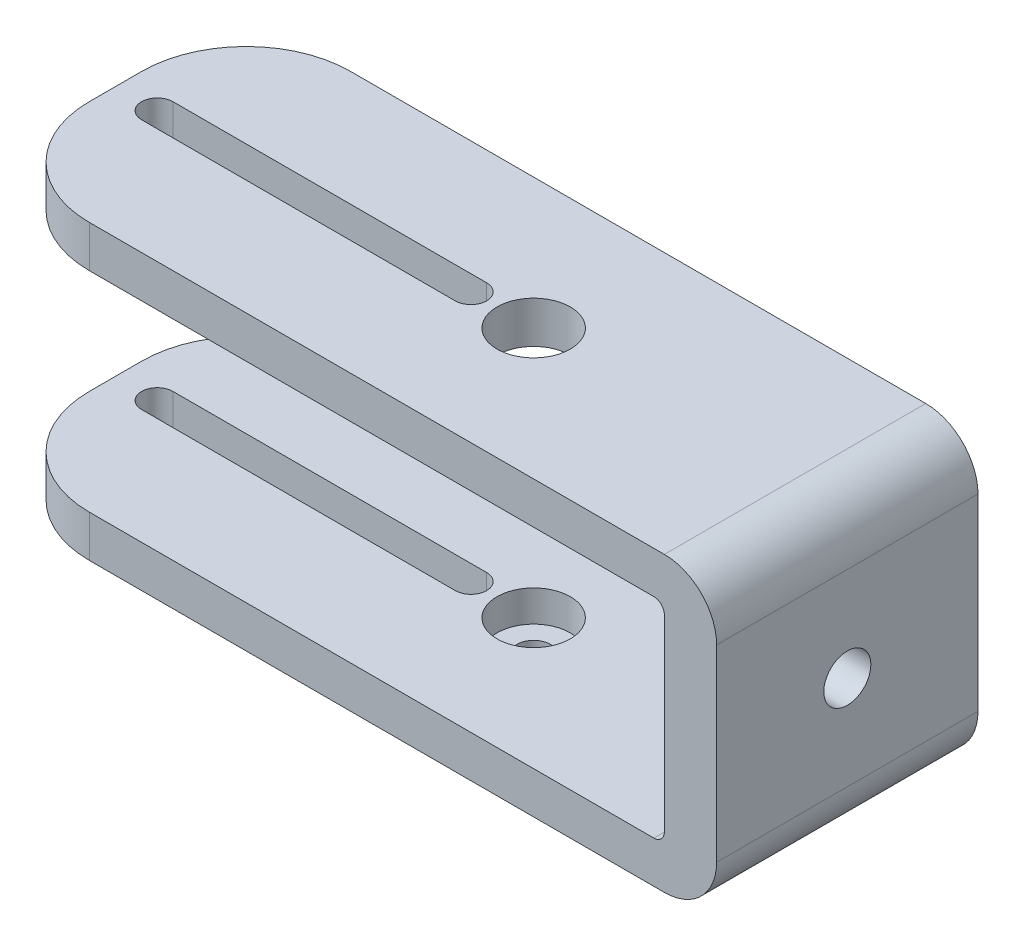
ISO-10303-21;
HEADER;
FILE_DESCRIPTION(('STEP AP214'),'2;1');
FILE_NAME('part.step','',(''),(''),'','','');
FILE_SCHEMA(('AUTOMOTIVE_DESIGN { 1 0 10303 214 1 1 1 1 }'));
ENDSEC;
DATA;
#1=APPLICATION_CONTEXT('core data for automotive mechanical design processes');
#2=APPLICATION_PROTOCOL_DEFINITION('international standard','automotive_design',2000,#1);
#3=PRODUCT_CONTEXT('',#1,'mechanical');
#4=PRODUCT('Part','Part','',(#3));
#5=PRODUCT_RELATED_PRODUCT_CATEGORY('part','',(#4));
#6=PRODUCT_DEFINITION_FORMATION('','',#4);
#7=PRODUCT_DEFINITION_CONTEXT('part definition',#1,'design');
#8=PRODUCT_DEFINITION('design','',#6,#7);
#9=PRODUCT_DEFINITION_SHAPE('','',#8);
#10=(LENGTH_UNIT() NAMED_UNIT(*) SI_UNIT(.MILLI.,.METRE.));
#11=(NAMED_UNIT(*) PLANE_ANGLE_UNIT() SI_UNIT($,.RADIAN.));
#12=(NAMED_UNIT(*) SI_UNIT($,.STERADIAN.) SOLID_ANGLE_UNIT());
#13=UNCERTAINTY_MEASURE_WITH_UNIT(LENGTH_MEASURE(1.E-05),#10,'distance_accuracy_value','');
#14=(GEOMETRIC_REPRESENTATION_CONTEXT(3) GLOBAL_UNCERTAINTY_ASSIGNED_CONTEXT((#13)) GLOBAL_UNIT_ASSIGNED_CONTEXT((#10,
#11,#12)) REPRESENTATION_CONTEXT('',''));
#15=CARTESIAN_POINT('',(0.,0.,0.));
#16=DIRECTION('',(0.,0.,1.));
#17=DIRECTION('',(1.,0.,0.));
#18=AXIS2_PLACEMENT_3D('',#15,#16,#17);
#19=CARTESIAN_POINT('',(5.,4.,0.));
#20=DIRECTION('',(0.,-1.,0.));
#21=DIRECTION('',(0.,0.,-1.));
#22=AXIS2_PLACEMENT_3D('',#19,#20,#21);
#23=CYLINDRICAL_SURFACE('',#22,1.6);
#24=CARTESIAN_POINT('',(5.,0.,0.));
#25=DIRECTION('',(0.,-1.,0.));
#26=DIRECTION('',(0.,0.,-1.));
#27=AXIS2_PLACEMENT_3D('',#24,#25,#26);
#28=CIRCLE('',#27,1.6);
#29=CARTESIAN_POINT('',(5.,0.,-1.6));
#30=VERTEX_POINT('',#29);
#31=EDGE_CURVE('E299',#30,#30,#28,.T.);
#32=ORIENTED_EDGE('',*,*,#31,.T.);
#33=EDGE_LOOP('',(#32));
#34=FACE_BOUND('',#33,.T.);
#35=CARTESIAN_POINT('',(5.,1.,0.));
#36=DIRECTION('',(0.,1.,0.));
#37=DIRECTION('',(0.,0.,1.));
#38=AXIS2_PLACEMENT_3D('',#35,#36,#37);
#39=CIRCLE('',#38,1.6);
#40=CARTESIAN_POINT('',(5.,1.,1.6));
#41=VERTEX_POINT('',#40);
#42=EDGE_CURVE('E295',#41,#41,#39,.F.);
#43=ORIENTED_EDGE('',*,*,#42,.F.);
#44=EDGE_LOOP('',(#43));
#45=FACE_BOUND('',#44,.T.);
#46=ADVANCED_FACE('F39',(#34,#45),#23,.F.);
#47=CARTESIAN_POINT('',(35.,4.,-12.5));
#48=DIRECTION('',(-1.,0.,0.));
#49=DIRECTION('',(0.,0.,1.));
#50=AXIS2_PLACEMENT_3D('',#47,#48,#49);
#51=PLANE('',#50);
#52=CARTESIAN_POINT('',(35.,14.,0.));
#53=DIRECTION('',(1.,0.,0.));
#54=DIRECTION('',(0.,0.,-1.));
#55=AXIS2_PLACEMENT_3D('',#52,#53,#54);
#56=CIRCLE('',#55,2.25);
#57=CARTESIAN_POINT('',(35.,14.,-2.25));
#58=VERTEX_POINT('',#57);
#59=EDGE_CURVE('E243',#58,#58,#56,.T.);
#60=ORIENTED_EDGE('',*,*,#59,.F.);
#61=EDGE_LOOP('',(#60));
#62=FACE_BOUND('',#61,.T.);
#63=DIRECTION('',(0.,-1.,0.));
#64=VECTOR('',#63,1.);
#65=CARTESIAN_POINT('',(35.,4.,12.5));
#66=LINE('',#65,#64);
#67=CARTESIAN_POINT('',(35.,23.,12.5));
#68=VERTEX_POINT('',#67);
#69=CARTESIAN_POINT('',(35.,5.,12.5));
#70=VERTEX_POINT('',#69);
#71=EDGE_CURVE('E345',#68,#70,#66,.T.);
#72=ORIENTED_EDGE('',*,*,#71,.T.);
#73=DIRECTION('',(0.,0.,-1.));
#74=VECTOR('',#73,1.);
#75=CARTESIAN_POINT('',(35.,5.,-12.5));
#76=LINE('',#75,#74);
#77=CARTESIAN_POINT('',(35.,5.,-12.5));
#78=VERTEX_POINT('',#77);
#79=EDGE_CURVE('E465',#70,#78,#76,.T.);
#80=ORIENTED_EDGE('',*,*,#79,.T.);
#81=DIRECTION('',(0.,-1.,0.));
#82=VECTOR('',#81,1.);
#83=CARTESIAN_POINT('',(35.,4.,-12.5));
#84=LINE('',#83,#82);
#85=CARTESIAN_POINT('',(35.,23.,-12.5));
#86=VERTEX_POINT('',#85);
#87=EDGE_CURVE('E357',#86,#78,#84,.T.);
#88=ORIENTED_EDGE('',*,*,#87,.F.);
#89=DIRECTION('',(0.,0.,-1.));
#90=VECTOR('',#89,1.);
#91=CARTESIAN_POINT('',(35.,23.,-12.5));
#92=LINE('',#91,#90);
#93=EDGE_CURVE('E462',#86,#68,#92,.F.);
#94=ORIENTED_EDGE('',*,*,#93,.T.);
#95=EDGE_LOOP('',(#72,#80,#88,#94));
#96=FACE_BOUND('',#95,.T.);
#97=ADVANCED_FACE('F484',(#62,#96),#51,.F.);
#98=CARTESIAN_POINT('',(-35.,4.,-12.5));
#99=DIRECTION('',(0.,0.,1.));
#100=DIRECTION('',(1.,0.,0.));
#101=AXIS2_PLACEMENT_3D('',#98,#99,#100);
#102=PLANE('',#101);
#103=ORIENTED_EDGE('',*,*,#87,.T.);
#104=CARTESIAN_POINT('',(30.,5.,-12.5));
#105=DIRECTION('',(0.,0.,1.));
#106=DIRECTION('',(1.,0.,0.));
#107=AXIS2_PLACEMENT_3D('',#104,#105,#106);
#108=CIRCLE('',#107,5.);
#109=CARTESIAN_POINT('',(30.,0.,-12.5));
#110=VERTEX_POINT('',#109);
#111=EDGE_CURVE('E472',#78,#110,#108,.F.);
#112=ORIENTED_EDGE('',*,*,#111,.T.);
#113=DIRECTION('',(-1.,0.,0.));
#114=VECTOR('',#113,1.);
#115=CARTESIAN_POINT('',(-35.,0.,-12.5));
#116=LINE('',#115,#114);
#117=CARTESIAN_POINT('',(-25.,0.,-12.5));
#118=VERTEX_POINT('',#117);
#119=EDGE_CURVE('E332',#110,#118,#116,.T.);
#120=ORIENTED_EDGE('',*,*,#119,.T.);
#121=DIRECTION('',(0.,-1.,0.));
#122=VECTOR('',#121,1.);
#123=CARTESIAN_POINT('',(-25.,4.,-12.5));
#124=LINE('',#123,#122);
#125=CARTESIAN_POINT('',(-25.,4.,-12.5));
#126=VERTEX_POINT('',#125);
#127=EDGE_CURVE('E429',#118,#126,#124,.F.);
#128=ORIENTED_EDGE('',*,*,#127,.T.);
#129=DIRECTION('',(-1.,0.,0.));
#130=VECTOR('',#129,1.);
#131=CARTESIAN_POINT('',(-35.,4.,-12.5));
#132=LINE('',#131,#130);
#133=CARTESIAN_POINT('',(29.,4.,-12.5));
#134=VERTEX_POINT('',#133);
#135=EDGE_CURVE('E333',#134,#126,#132,.T.);
#136=ORIENTED_EDGE('',*,*,#135,.F.);
#137=CARTESIAN_POINT('',(29.,5.,-12.5));
#138=DIRECTION('',(0.,0.,1.));
#139=DIRECTION('',(1.,0.,0.));
#140=AXIS2_PLACEMENT_3D('',#137,#138,#139);
#141=CIRCLE('',#140,1.);
#142=CARTESIAN_POINT('',(30.,5.,-12.5));
#143=VERTEX_POINT('',#142);
#144=EDGE_CURVE('E459',#134,#143,#141,.T.);
#145=ORIENTED_EDGE('',*,*,#144,.T.);
#146=DIRECTION('',(0.,-1.,0.));
#147=VECTOR('',#146,1.);
#148=CARTESIAN_POINT('',(30.,24.,-12.5));
#149=LINE('',#148,#147);
#150=CARTESIAN_POINT('',(30.,23.,-12.5));
#151=VERTEX_POINT('',#150);
#152=EDGE_CURVE('E328',#151,#143,#149,.T.);
#153=ORIENTED_EDGE('',*,*,#152,.F.);
#154=CARTESIAN_POINT('',(29.,23.,-12.5));
#155=DIRECTION('',(0.,0.,1.));
#156=DIRECTION('',(1.,0.,0.));
#157=AXIS2_PLACEMENT_3D('',#154,#155,#156);
#158=CIRCLE('',#157,1.);
#159=CARTESIAN_POINT('',(29.,24.,-12.5));
#160=VERTEX_POINT('',#159);
#161=EDGE_CURVE('E453',#151,#160,#158,.T.);
#162=ORIENTED_EDGE('',*,*,#161,.T.);
#163=DIRECTION('',(-1.,0.,0.));
#164=VECTOR('',#163,1.);
#165=CARTESIAN_POINT('',(35.,24.,-12.5));
#166=LINE('',#165,#164);
#167=CARTESIAN_POINT('',(-25.,24.,-12.5));
#168=VERTEX_POINT('',#167);
#169=EDGE_CURVE('E303',#160,#168,#166,.T.);
#170=ORIENTED_EDGE('',*,*,#169,.T.);
#171=DIRECTION('',(0.,-1.,0.));
#172=VECTOR('',#171,1.);
#173=CARTESIAN_POINT('',(-25.,4.,-12.5));
#174=LINE('',#173,#172);
#175=CARTESIAN_POINT('',(-25.,28.,-12.5));
#176=VERTEX_POINT('',#175);
#177=EDGE_CURVE('E425',#168,#176,#174,.F.);
#178=ORIENTED_EDGE('',*,*,#177,.T.);
#179=DIRECTION('',(-1.,0.,0.));
#180=VECTOR('',#179,1.);
#181=CARTESIAN_POINT('',(35.,28.,-12.5));
#182=LINE('',#181,#180);
#183=CARTESIAN_POINT('',(30.,28.,-12.5));
#184=VERTEX_POINT('',#183);
#185=EDGE_CURVE('E304',#184,#176,#182,.T.);
#186=ORIENTED_EDGE('',*,*,#185,.F.);
#187=CARTESIAN_POINT('',(30.,23.,-12.5));
#188=DIRECTION('',(0.,0.,1.));
#189=DIRECTION('',(1.,0.,0.));
#190=AXIS2_PLACEMENT_3D('',#187,#188,#189);
#191=CIRCLE('',#190,5.);
#192=EDGE_CURVE('E469',#184,#86,#191,.F.);
#193=ORIENTED_EDGE('',*,*,#192,.T.);
#194=EDGE_LOOP('',(#103,#112,#120,#128,#136,#145,#153,#162,#170,#178,#186,#193));
#195=FACE_BOUND('',#194,.T.);
#196=ADVANCED_FACE('F489',(#195),#102,.F.);
#197=CARTESIAN_POINT('',(-35.,4.,-12.5));
#198=DIRECTION('',(1.,0.,0.));
#199=DIRECTION('',(0.,0.,-1.));
#200=AXIS2_PLACEMENT_3D('',#197,#198,#199);
#201=PLANE('',#200);
#202=DIRECTION('',(0.,0.,1.));
#203=VECTOR('',#202,1.);
#204=CARTESIAN_POINT('',(-35.,0.,-12.5));
#205=LINE('',#204,#203);
#206=CARTESIAN_POINT('',(-35.,0.,-2.5));
#207=VERTEX_POINT('',#206);
#208=CARTESIAN_POINT('',(-35.,0.,2.5));
#209=VERTEX_POINT('',#208);
#210=EDGE_CURVE('E348',#207,#209,#205,.T.);
#211=ORIENTED_EDGE('',*,*,#210,.T.);
#212=DIRECTION('',(0.,-1.,0.));
#213=VECTOR('',#212,1.);
#214=CARTESIAN_POINT('',(-35.,4.,2.5));
#215=LINE('',#214,#213);
#216=CARTESIAN_POINT('',(-35.,4.,2.5));
#217=VERTEX_POINT('',#216);
#218=EDGE_CURVE('E416',#209,#217,#215,.F.);
#219=ORIENTED_EDGE('',*,*,#218,.T.);
#220=DIRECTION('',(0.,0.,1.));
#221=VECTOR('',#220,1.);
#222=CARTESIAN_POINT('',(-35.,4.,-12.5));
#223=LINE('',#222,#221);
#224=CARTESIAN_POINT('',(-35.,4.,-2.5));
#225=VERTEX_POINT('',#224);
#226=EDGE_CURVE('E336',#225,#217,#223,.T.);
#227=ORIENTED_EDGE('',*,*,#226,.F.);
#228=DIRECTION('',(0.,-1.,0.));
#229=VECTOR('',#228,1.);
#230=CARTESIAN_POINT('',(-35.,4.,-2.5));
#231=LINE('',#230,#229);
#232=EDGE_CURVE('E412',#225,#207,#231,.T.);
#233=ORIENTED_EDGE('',*,*,#232,.T.);
#234=EDGE_LOOP('',(#211,#219,#227,#233));
#235=FACE_BOUND('',#234,.T.);
#236=ADVANCED_FACE('F573',(#235),#201,.F.);
#237=CARTESIAN_POINT('',(-35.,4.,12.5));
#238=DIRECTION('',(0.,0.,-1.));
#239=DIRECTION('',(-1.,0.,0.));
#240=AXIS2_PLACEMENT_3D('',#237,#238,#239);
#241=PLANE('',#240);
#242=DIRECTION('',(1.,0.,0.));
#243=VECTOR('',#242,1.);
#244=CARTESIAN_POINT('',(-35.,0.,12.5));
#245=LINE('',#244,#243);
#246=CARTESIAN_POINT('',(-25.,0.,12.5));
#247=VERTEX_POINT('',#246);
#248=CARTESIAN_POINT('',(30.,0.,12.5));
#249=VERTEX_POINT('',#248);
#250=EDGE_CURVE('E337',#247,#249,#245,.T.);
#251=ORIENTED_EDGE('',*,*,#250,.T.);
#252=CARTESIAN_POINT('',(30.,5.,12.5));
#253=DIRECTION('',(0.,0.,-1.));
#254=DIRECTION('',(-1.,0.,0.));
#255=AXIS2_PLACEMENT_3D('',#252,#253,#254);
#256=CIRCLE('',#255,5.);
#257=EDGE_CURVE('E48',#249,#70,#256,.F.);
#258=ORIENTED_EDGE('',*,*,#257,.T.);
#259=ORIENTED_EDGE('',*,*,#71,.F.);
#260=CARTESIAN_POINT('',(30.,23.,12.5));
#261=DIRECTION('',(0.,0.,-1.));
#262=DIRECTION('',(-1.,0.,0.));
#263=AXIS2_PLACEMENT_3D('',#260,#261,#262);
#264=CIRCLE('',#263,5.);
#265=CARTESIAN_POINT('',(30.,28.,12.5));
#266=VERTEX_POINT('',#265);
#267=EDGE_CURVE('E55',#68,#266,#264,.F.);
#268=ORIENTED_EDGE('',*,*,#267,.T.);
#269=DIRECTION('',(1.,0.,0.));
#270=VECTOR('',#269,1.);
#271=CARTESIAN_POINT('',(35.,28.,12.5));
#272=LINE('',#271,#270);
#273=CARTESIAN_POINT('',(-25.,28.,12.5));
#274=VERTEX_POINT('',#273);
#275=EDGE_CURVE('E312',#274,#266,#272,.T.);
#276=ORIENTED_EDGE('',*,*,#275,.F.);
#277=DIRECTION('',(0.,-1.,0.));
#278=VECTOR('',#277,1.);
#279=CARTESIAN_POINT('',(-25.,4.,12.5));
#280=LINE('',#279,#278);
#281=CARTESIAN_POINT('',(-25.,24.,12.5));
#282=VERTEX_POINT('',#281);
#283=EDGE_CURVE('E381',#274,#282,#280,.T.);
#284=ORIENTED_EDGE('',*,*,#283,.T.);
#285=DIRECTION('',(1.,0.,0.));
#286=VECTOR('',#285,1.);
#287=CARTESIAN_POINT('',(35.,24.,12.5));
#288=LINE('',#287,#286);
#289=CARTESIAN_POINT('',(29.,24.,12.5));
#290=VERTEX_POINT('',#289);
#291=EDGE_CURVE('E308',#282,#290,#288,.T.);
#292=ORIENTED_EDGE('',*,*,#291,.T.);
#293=CARTESIAN_POINT('',(29.,23.,12.5));
#294=DIRECTION('',(0.,0.,-1.));
#295=DIRECTION('',(-1.,0.,0.));
#296=AXIS2_PLACEMENT_3D('',#293,#294,#295);
#297=CIRCLE('',#296,1.);
#298=CARTESIAN_POINT('',(30.,23.,12.5));
#299=VERTEX_POINT('',#298);
#300=EDGE_CURVE('E450',#290,#299,#297,.T.);
#301=ORIENTED_EDGE('',*,*,#300,.T.);
#302=DIRECTION('',(0.,-1.,0.));
#303=VECTOR('',#302,1.);
#304=CARTESIAN_POINT('',(30.,24.,12.5));
#305=LINE('',#304,#303);
#306=CARTESIAN_POINT('',(30.,5.,12.5));
#307=VERTEX_POINT('',#306);
#308=EDGE_CURVE('E315',#299,#307,#305,.T.);
#309=ORIENTED_EDGE('',*,*,#308,.T.);
#310=CARTESIAN_POINT('',(29.,5.,12.5));
#311=DIRECTION('',(0.,0.,-1.));
#312=DIRECTION('',(-1.,0.,0.));
#313=AXIS2_PLACEMENT_3D('',#310,#311,#312);
#314=CIRCLE('',#313,1.);
#315=CARTESIAN_POINT('',(29.,4.,12.5));
#316=VERTEX_POINT('',#315);
#317=EDGE_CURVE('E456',#307,#316,#314,.T.);
#318=ORIENTED_EDGE('',*,*,#317,.T.);
#319=DIRECTION('',(1.,0.,0.));
#320=VECTOR('',#319,1.);
#321=CARTESIAN_POINT('',(-35.,4.,12.5));
#322=LINE('',#321,#320);
#323=CARTESIAN_POINT('',(-25.,4.,12.5));
#324=VERTEX_POINT('',#323);
#325=EDGE_CURVE('E341',#324,#316,#322,.T.);
#326=ORIENTED_EDGE('',*,*,#325,.F.);
#327=DIRECTION('',(0.,-1.,0.));
#328=VECTOR('',#327,1.);
#329=CARTESIAN_POINT('',(-25.,4.,12.5));
#330=LINE('',#329,#328);
#331=EDGE_CURVE('E377',#324,#247,#330,.T.);
#332=ORIENTED_EDGE('',*,*,#331,.T.);
#333=EDGE_LOOP('',(#251,#258,#259,#268,#276,#284,#292,#301,#309,#318,#326,#332));
#334=FACE_BOUND('',#333,.T.);
#335=ADVANCED_FACE('F480',(#334),#241,.F.);
#336=CARTESIAN_POINT('',(0.,4.,0.));
#337=DIRECTION('',(0.,1.,0.));
#338=DIRECTION('',(0.,0.,1.));
#339=AXIS2_PLACEMENT_3D('',#336,#337,#338);
#340=PLANE('',#339);
#341=CARTESIAN_POINT('',(-31.,4.,0.));
#342=DIRECTION('',(0.,1.,0.));
#343=DIRECTION('',(0.,0.,1.));
#344=AXIS2_PLACEMENT_3D('',#341,#342,#343);
#345=CIRCLE('',#344,1.5);
#346=CARTESIAN_POINT('',(-31.,4.,-1.5));
#347=VERTEX_POINT('',#346);
#348=CARTESIAN_POINT('',(-31.,4.,1.5));
#349=VERTEX_POINT('',#348);
#350=EDGE_CURVE('E213',#347,#349,#345,.T.);
#351=ORIENTED_EDGE('',*,*,#350,.F.);
#352=DIRECTION('',(-1.,0.,0.));
#353=VECTOR('',#352,1.);
#354=CARTESIAN_POINT('',(0.,4.,-1.5));
#355=LINE('',#354,#353);
#356=CARTESIAN_POINT('',(-1.,4.,-1.5));
#357=VERTEX_POINT('',#356);
#358=EDGE_CURVE('E277',#357,#347,#355,.T.);
#359=ORIENTED_EDGE('',*,*,#358,.F.);
#360=CARTESIAN_POINT('',(-1.,4.,0.));
#361=DIRECTION('',(0.,1.,0.));
#362=DIRECTION('',(0.,0.,1.));
#363=AXIS2_PLACEMENT_3D('',#360,#361,#362);
#364=CIRCLE('',#363,1.5);
#365=CARTESIAN_POINT('',(-1.,4.,1.5));
#366=VERTEX_POINT('',#365);
#367=EDGE_CURVE('E274',#366,#357,#364,.T.);
#368=ORIENTED_EDGE('',*,*,#367,.F.);
#369=DIRECTION('',(1.,0.,0.));
#370=VECTOR('',#369,1.);
#371=CARTESIAN_POINT('',(0.,4.,1.5));
#372=LINE('',#371,#370);
#373=EDGE_CURVE('E263',#349,#366,#372,.T.);
#374=ORIENTED_EDGE('',*,*,#373,.F.);
#375=EDGE_LOOP('',(#351,#359,#368,#374));
#376=FACE_BOUND('',#375,.T.);
#377=CARTESIAN_POINT('',(5.,4.,0.));
#378=DIRECTION('',(0.,1.,0.));
#379=DIRECTION('',(0.,0.,1.));
#380=AXIS2_PLACEMENT_3D('',#377,#378,#379);
#381=CIRCLE('',#380,3.5);
#382=CARTESIAN_POINT('',(5.,4.,3.5));
#383=VERTEX_POINT('',#382);
#384=EDGE_CURVE('E287',#383,#383,#381,.T.);
#385=ORIENTED_EDGE('',*,*,#384,.F.);
#386=EDGE_LOOP('',(#385));
#387=FACE_BOUND('',#386,.T.);
#388=ORIENTED_EDGE('',*,*,#325,.T.);
#389=DIRECTION('',(0.,0.,1.));
#390=VECTOR('',#389,1.);
#391=CARTESIAN_POINT('',(29.,4.,0.));
#392=LINE('',#391,#390);
#393=EDGE_CURVE('E447',#316,#134,#392,.F.);
#394=ORIENTED_EDGE('',*,*,#393,.T.);
#395=ORIENTED_EDGE('',*,*,#135,.T.);
#396=CARTESIAN_POINT('',(-25.,4.,-2.5));
#397=DIRECTION('',(0.,1.,0.));
#398=DIRECTION('',(0.,0.,1.));
#399=AXIS2_PLACEMENT_3D('',#396,#397,#398);
#400=CIRCLE('',#399,10.);
#401=EDGE_CURVE('E419',#126,#225,#400,.T.);
#402=ORIENTED_EDGE('',*,*,#401,.T.);
#403=ORIENTED_EDGE('',*,*,#226,.T.);
#404=CARTESIAN_POINT('',(-25.,4.,2.5));
#405=DIRECTION('',(0.,1.,0.));
#406=DIRECTION('',(0.,0.,1.));
#407=AXIS2_PLACEMENT_3D('',#404,#405,#406);
#408=CIRCLE('',#407,10.);
#409=EDGE_CURVE('E422',#217,#324,#408,.T.);
#410=ORIENTED_EDGE('',*,*,#409,.T.);
#411=EDGE_LOOP('',(#388,#394,#395,#402,#403,#410));
#412=FACE_BOUND('',#411,.T.);
#413=ADVANCED_FACE('F565',(#376,#387,#412),#340,.T.);
#414=CARTESIAN_POINT('',(0.,0.,0.));
#415=DIRECTION('',(0.,1.,0.));
#416=DIRECTION('',(0.,0.,1.));
#417=AXIS2_PLACEMENT_3D('',#414,#415,#416);
#418=PLANE('',#417);
#419=DIRECTION('',(-1.,0.,0.));
#420=VECTOR('',#419,1.);
#421=CARTESIAN_POINT('',(-31.,0.,-1.5));
#422=LINE('',#421,#420);
#423=CARTESIAN_POINT('',(-1.,0.,-1.5));
#424=VERTEX_POINT('',#423);
#425=CARTESIAN_POINT('',(-31.,0.,-1.5));
#426=VERTEX_POINT('',#425);
#427=EDGE_CURVE('E234',#424,#426,#422,.T.);
#428=ORIENTED_EDGE('',*,*,#427,.T.);
#429=CARTESIAN_POINT('',(-31.,0.,0.));
#430=DIRECTION('',(0.,1.,0.));
#431=DIRECTION('',(0.,0.,1.));
#432=AXIS2_PLACEMENT_3D('',#429,#430,#431);
#433=CIRCLE('',#432,1.5);
#434=CARTESIAN_POINT('',(-31.,0.,1.5));
#435=VERTEX_POINT('',#434);
#436=EDGE_CURVE('E210',#426,#435,#433,.T.);
#437=ORIENTED_EDGE('',*,*,#436,.T.);
#438=DIRECTION('',(1.,0.,0.));
#439=VECTOR('',#438,1.);
#440=CARTESIAN_POINT('',(-31.,0.,1.5));
#441=LINE('',#440,#439);
#442=CARTESIAN_POINT('',(-1.,0.,1.5));
#443=VERTEX_POINT('',#442);
#444=EDGE_CURVE('E222',#435,#443,#441,.T.);
#445=ORIENTED_EDGE('',*,*,#444,.T.);
#446=CARTESIAN_POINT('',(-1.,0.,0.));
#447=DIRECTION('',(0.,1.,0.));
#448=DIRECTION('',(0.,0.,1.));
#449=AXIS2_PLACEMENT_3D('',#446,#447,#448);
#450=CIRCLE('',#449,1.5);
#451=EDGE_CURVE('E229',#443,#424,#450,.T.);
#452=ORIENTED_EDGE('',*,*,#451,.T.);
#453=EDGE_LOOP('',(#428,#437,#445,#452));
#454=FACE_BOUND('',#453,.T.);
#455=ORIENTED_EDGE('',*,*,#31,.F.);
#456=EDGE_LOOP('',(#455));
#457=FACE_BOUND('',#456,.T.);
#458=ORIENTED_EDGE('',*,*,#119,.F.);
#459=DIRECTION('',(0.,0.,-1.));
#460=VECTOR('',#459,1.);
#461=CARTESIAN_POINT('',(30.,0.,0.));
#462=LINE('',#461,#460);
#463=EDGE_CURVE('E63',#110,#249,#462,.F.);
#464=ORIENTED_EDGE('',*,*,#463,.T.);
#465=ORIENTED_EDGE('',*,*,#250,.F.);
#466=CARTESIAN_POINT('',(-25.,0.,2.5));
#467=DIRECTION('',(0.,1.,0.));
#468=DIRECTION('',(0.,0.,1.));
#469=AXIS2_PLACEMENT_3D('',#466,#467,#468);
#470=CIRCLE('',#469,10.);
#471=EDGE_CURVE('E409',#247,#209,#470,.F.);
#472=ORIENTED_EDGE('',*,*,#471,.T.);
#473=ORIENTED_EDGE('',*,*,#210,.F.);
#474=CARTESIAN_POINT('',(-25.,0.,-2.5));
#475=DIRECTION('',(0.,1.,0.));
#476=DIRECTION('',(0.,0.,1.));
#477=AXIS2_PLACEMENT_3D('',#474,#475,#476);
#478=CIRCLE('',#477,10.);
#479=EDGE_CURVE('E405',#207,#118,#478,.F.);
#480=ORIENTED_EDGE('',*,*,#479,.T.);
#481=EDGE_LOOP('',(#458,#464,#465,#472,#473,#480));
#482=FACE_BOUND('',#481,.T.);
#483=ADVANCED_FACE('F231',(#454,#457,#482),#418,.F.);
#484=CARTESIAN_POINT('',(30.,24.,-12.5));
#485=DIRECTION('',(1.,0.,0.));
#486=DIRECTION('',(0.,0.,-1.));
#487=AXIS2_PLACEMENT_3D('',#484,#485,#486);
#488=PLANE('',#487);
#489=CARTESIAN_POINT('',(30.,14.,0.));
#490=DIRECTION('',(1.,0.,0.));
#491=DIRECTION('',(0.,0.,-1.));
#492=AXIS2_PLACEMENT_3D('',#489,#490,#491);
#493=CIRCLE('',#492,2.25);
#494=CARTESIAN_POINT('',(30.,14.,-2.25));
#495=VERTEX_POINT('',#494);
#496=EDGE_CURVE('E253',#495,#495,#493,.T.);
#497=ORIENTED_EDGE('',*,*,#496,.T.);
#498=EDGE_LOOP('',(#497));
#499=FACE_BOUND('',#498,.T.);
#500=ORIENTED_EDGE('',*,*,#308,.F.);
#501=DIRECTION('',(0.,0.,1.));
#502=VECTOR('',#501,1.);
#503=CARTESIAN_POINT('',(30.,23.,-12.5));
#504=LINE('',#503,#502);
#505=EDGE_CURVE('E444',#299,#151,#504,.F.);
#506=ORIENTED_EDGE('',*,*,#505,.T.);
#507=ORIENTED_EDGE('',*,*,#152,.T.);
#508=DIRECTION('',(0.,0.,1.));
#509=VECTOR('',#508,1.);
#510=CARTESIAN_POINT('',(30.,5.,-12.5));
#511=LINE('',#510,#509);
#512=EDGE_CURVE('E440',#143,#307,#511,.T.);
#513=ORIENTED_EDGE('',*,*,#512,.T.);
#514=EDGE_LOOP('',(#500,#506,#507,#513));
#515=FACE_BOUND('',#514,.T.);
#516=ADVANCED_FACE('F506',(#499,#515),#488,.F.);
#517=CARTESIAN_POINT('',(-35.,28.,-12.5));
#518=DIRECTION('',(1.,0.,0.));
#519=DIRECTION('',(0.,0.,-1.));
#520=AXIS2_PLACEMENT_3D('',#517,#518,#519);
#521=PLANE('',#520);
#522=DIRECTION('',(0.,0.,1.));
#523=VECTOR('',#522,1.);
#524=CARTESIAN_POINT('',(-35.,24.,-12.5));
#525=LINE('',#524,#523);
#526=CARTESIAN_POINT('',(-35.,24.,-2.5));
#527=VERTEX_POINT('',#526);
#528=CARTESIAN_POINT('',(-35.,24.,2.5));
#529=VERTEX_POINT('',#528);
#530=EDGE_CURVE('E318',#527,#529,#525,.T.);
#531=ORIENTED_EDGE('',*,*,#530,.T.);
#532=DIRECTION('',(0.,-1.,0.));
#533=VECTOR('',#532,1.);
#534=CARTESIAN_POINT('',(-35.,28.,2.5));
#535=LINE('',#534,#533);
#536=CARTESIAN_POINT('',(-35.,28.,2.5));
#537=VERTEX_POINT('',#536);
#538=EDGE_CURVE('E396',#529,#537,#535,.F.);
#539=ORIENTED_EDGE('',*,*,#538,.T.);
#540=DIRECTION('',(0.,0.,1.));
#541=VECTOR('',#540,1.);
#542=CARTESIAN_POINT('',(-35.,28.,-12.5));
#543=LINE('',#542,#541);
#544=CARTESIAN_POINT('',(-35.,28.,-2.5));
#545=VERTEX_POINT('',#544);
#546=EDGE_CURVE('E307',#545,#537,#543,.T.);
#547=ORIENTED_EDGE('',*,*,#546,.F.);
#548=DIRECTION('',(0.,-1.,0.));
#549=VECTOR('',#548,1.);
#550=CARTESIAN_POINT('',(-35.,28.,-2.5));
#551=LINE('',#550,#549);
#552=EDGE_CURVE('E392',#545,#527,#551,.T.);
#553=ORIENTED_EDGE('',*,*,#552,.T.);
#554=EDGE_LOOP('',(#531,#539,#547,#553));
#555=FACE_BOUND('',#554,.T.);
#556=ADVANCED_FACE('F529',(#555),#521,.F.);
#557=CARTESIAN_POINT('',(0.,28.,0.));
#558=DIRECTION('',(0.,-1.,0.));
#559=DIRECTION('',(0.,0.,-1.));
#560=AXIS2_PLACEMENT_3D('',#557,#558,#559);
#561=PLANE('',#560);
#562=DIRECTION('',(1.,0.,0.));
#563=VECTOR('',#562,1.);
#564=CARTESIAN_POINT('',(-31.,28.,1.5));
#565=LINE('',#564,#563);
#566=CARTESIAN_POINT('',(-31.,28.,1.5));
#567=VERTEX_POINT('',#566);
#568=CARTESIAN_POINT('',(-1.,28.,1.5));
#569=VERTEX_POINT('',#568);
#570=EDGE_CURVE('E252',#567,#569,#565,.T.);
#571=ORIENTED_EDGE('',*,*,#570,.F.);
#572=CARTESIAN_POINT('',(-31.,28.,0.));
#573=DIRECTION('',(0.,1.,0.));
#574=DIRECTION('',(0.,0.,1.));
#575=AXIS2_PLACEMENT_3D('',#572,#573,#574);
#576=CIRCLE('',#575,1.5);
#577=CARTESIAN_POINT('',(-31.,28.,-1.5));
#578=VERTEX_POINT('',#577);
#579=EDGE_CURVE('E249',#578,#567,#576,.T.);
#580=ORIENTED_EDGE('',*,*,#579,.F.);
#581=DIRECTION('',(-1.,0.,0.));
#582=VECTOR('',#581,1.);
#583=CARTESIAN_POINT('',(-31.,28.,-1.5));
#584=LINE('',#583,#582);
#585=CARTESIAN_POINT('',(-1.,28.,-1.5));
#586=VERTEX_POINT('',#585);
#587=EDGE_CURVE('E236',#586,#578,#584,.T.);
#588=ORIENTED_EDGE('',*,*,#587,.F.);
#589=CARTESIAN_POINT('',(-1.,28.,0.));
#590=DIRECTION('',(0.,1.,0.));
#591=DIRECTION('',(0.,0.,1.));
#592=AXIS2_PLACEMENT_3D('',#589,#590,#591);
#593=CIRCLE('',#592,1.5);
#594=EDGE_CURVE('E240',#569,#586,#593,.T.);
#595=ORIENTED_EDGE('',*,*,#594,.F.);
#596=EDGE_LOOP('',(#571,#580,#588,#595));
#597=FACE_BOUND('',#596,.T.);
#598=CARTESIAN_POINT('',(5.,28.,0.));
#599=DIRECTION('',(0.,-1.,0.));
#600=DIRECTION('',(0.,0.,-1.));
#601=AXIS2_PLACEMENT_3D('',#598,#599,#600);
#602=CIRCLE('',#601,3.5);
#603=CARTESIAN_POINT('',(5.,28.,-3.5));
#604=VERTEX_POINT('',#603);
#605=EDGE_CURVE('E283',#604,#604,#602,.T.);
#606=ORIENTED_EDGE('',*,*,#605,.T.);
#607=EDGE_LOOP('',(#606));
#608=FACE_BOUND('',#607,.T.);
#609=ORIENTED_EDGE('',*,*,#275,.T.);
#610=DIRECTION('',(0.,0.,-1.));
#611=VECTOR('',#610,1.);
#612=CARTESIAN_POINT('',(30.,28.,0.));
#613=LINE('',#612,#611);
#614=EDGE_CURVE('E11',#266,#184,#613,.T.);
#615=ORIENTED_EDGE('',*,*,#614,.T.);
#616=ORIENTED_EDGE('',*,*,#185,.T.);
#617=CARTESIAN_POINT('',(-25.,28.,-2.5));
#618=DIRECTION('',(0.,-1.,0.));
#619=DIRECTION('',(0.,0.,-1.));
#620=AXIS2_PLACEMENT_3D('',#617,#618,#619);
#621=CIRCLE('',#620,10.);
#622=EDGE_CURVE('E399',#176,#545,#621,.F.);
#623=ORIENTED_EDGE('',*,*,#622,.T.);
#624=ORIENTED_EDGE('',*,*,#546,.T.);
#625=CARTESIAN_POINT('',(-25.,28.,2.5));
#626=DIRECTION('',(0.,-1.,0.));
#627=DIRECTION('',(0.,0.,-1.));
#628=AXIS2_PLACEMENT_3D('',#625,#626,#627);
#629=CIRCLE('',#628,10.);
#630=EDGE_CURVE('E402',#537,#274,#629,.F.);
#631=ORIENTED_EDGE('',*,*,#630,.T.);
#632=EDGE_LOOP('',(#609,#615,#616,#623,#624,#631));
#633=FACE_BOUND('',#632,.T.);
#634=ADVANCED_FACE('F526',(#597,#608,#633),#561,.F.);
#635=CARTESIAN_POINT('',(0.,24.,0.));
#636=DIRECTION('',(0.,-1.,0.));
#637=DIRECTION('',(0.,0.,-1.));
#638=AXIS2_PLACEMENT_3D('',#635,#636,#637);
#639=PLANE('',#638);
#640=CARTESIAN_POINT('',(-31.,24.,0.));
#641=DIRECTION('',(0.,-1.,0.));
#642=DIRECTION('',(0.,0.,-1.));
#643=AXIS2_PLACEMENT_3D('',#640,#641,#642);
#644=CIRCLE('',#643,1.5);
#645=CARTESIAN_POINT('',(-31.,24.,1.5));
#646=VERTEX_POINT('',#645);
#647=CARTESIAN_POINT('',(-31.,24.,-1.5));
#648=VERTEX_POINT('',#647);
#649=EDGE_CURVE('E374',#646,#648,#644,.T.);
#650=ORIENTED_EDGE('',*,*,#649,.F.);
#651=DIRECTION('',(-1.,0.,0.));
#652=VECTOR('',#651,1.);
#653=CARTESIAN_POINT('',(0.,24.,1.5));
#654=LINE('',#653,#652);
#655=CARTESIAN_POINT('',(-1.,24.,1.5));
#656=VERTEX_POINT('',#655);
#657=EDGE_CURVE('E361',#656,#646,#654,.T.);
#658=ORIENTED_EDGE('',*,*,#657,.F.);
#659=CARTESIAN_POINT('',(-1.,24.,0.));
#660=DIRECTION('',(0.,-1.,0.));
#661=DIRECTION('',(0.,0.,-1.));
#662=AXIS2_PLACEMENT_3D('',#659,#660,#661);
#663=CIRCLE('',#662,1.5);
#664=CARTESIAN_POINT('',(-1.,24.,-1.5));
#665=VERTEX_POINT('',#664);
#666=EDGE_CURVE('E367',#665,#656,#663,.T.);
#667=ORIENTED_EDGE('',*,*,#666,.F.);
#668=DIRECTION('',(1.,0.,0.));
#669=VECTOR('',#668,1.);
#670=CARTESIAN_POINT('',(0.,24.,-1.5));
#671=LINE('',#670,#669);
#672=EDGE_CURVE('E371',#648,#665,#671,.T.);
#673=ORIENTED_EDGE('',*,*,#672,.F.);
#674=EDGE_LOOP('',(#650,#658,#667,#673));
#675=FACE_BOUND('',#674,.T.);
#676=CARTESIAN_POINT('',(5.,24.,0.));
#677=DIRECTION('',(0.,-1.,0.));
#678=DIRECTION('',(0.,0.,-1.));
#679=AXIS2_PLACEMENT_3D('',#676,#677,#678);
#680=CIRCLE('',#679,3.5);
#681=CARTESIAN_POINT('',(5.,24.,-3.5));
#682=VERTEX_POINT('',#681);
#683=EDGE_CURVE('E282',#682,#682,#680,.T.);
#684=ORIENTED_EDGE('',*,*,#683,.F.);
#685=EDGE_LOOP('',(#684));
#686=FACE_BOUND('',#685,.T.);
#687=ORIENTED_EDGE('',*,*,#169,.F.);
#688=DIRECTION('',(0.,0.,1.));
#689=VECTOR('',#688,1.);
#690=CARTESIAN_POINT('',(29.,24.,0.));
#691=LINE('',#690,#689);
#692=EDGE_CURVE('E433',#160,#290,#691,.T.);
#693=ORIENTED_EDGE('',*,*,#692,.T.);
#694=ORIENTED_EDGE('',*,*,#291,.F.);
#695=CARTESIAN_POINT('',(-25.,24.,2.5));
#696=DIRECTION('',(0.,-1.,0.));
#697=DIRECTION('',(0.,0.,-1.));
#698=AXIS2_PLACEMENT_3D('',#695,#696,#697);
#699=CIRCLE('',#698,10.);
#700=EDGE_CURVE('E389',#282,#529,#699,.T.);
#701=ORIENTED_EDGE('',*,*,#700,.T.);
#702=ORIENTED_EDGE('',*,*,#530,.F.);
#703=CARTESIAN_POINT('',(-25.,24.,-2.5));
#704=DIRECTION('',(0.,-1.,0.));
#705=DIRECTION('',(0.,0.,-1.));
#706=AXIS2_PLACEMENT_3D('',#703,#704,#705);
#707=CIRCLE('',#706,10.);
#708=EDGE_CURVE('E385',#527,#168,#707,.T.);
#709=ORIENTED_EDGE('',*,*,#708,.T.);
#710=EDGE_LOOP('',(#687,#693,#694,#701,#702,#709));
#711=FACE_BOUND('',#710,.T.);
#712=ADVANCED_FACE('F516',(#675,#686,#711),#639,.T.);
#713=CARTESIAN_POINT('',(5.,1.,0.));
#714=DIRECTION('',(0.,1.,0.));
#715=DIRECTION('',(0.,0.,1.));
#716=AXIS2_PLACEMENT_3D('',#713,#714,#715);
#717=PLANE('',#716);
#718=CARTESIAN_POINT('',(5.,1.,0.));
#719=DIRECTION('',(0.,1.,0.));
#720=DIRECTION('',(0.,0.,1.));
#721=AXIS2_PLACEMENT_3D('',#718,#719,#720);
#722=CIRCLE('',#721,3.5);
#723=CARTESIAN_POINT('',(5.,1.,3.5));
#724=VERTEX_POINT('',#723);
#725=EDGE_CURVE('E291',#724,#724,#722,.T.);
#726=ORIENTED_EDGE('',*,*,#725,.T.);
#727=EDGE_LOOP('',(#726));
#728=FACE_BOUND('',#727,.T.);
#729=ORIENTED_EDGE('',*,*,#42,.T.);
#730=EDGE_LOOP('',(#729));
#731=FACE_BOUND('',#730,.T.);
#732=ADVANCED_FACE('F558',(#728,#731),#717,.T.);
#733=CARTESIAN_POINT('',(5.,1.,0.));
#734=DIRECTION('',(0.,1.,0.));
#735=DIRECTION('',(0.,0.,1.));
#736=AXIS2_PLACEMENT_3D('',#733,#734,#735);
#737=CYLINDRICAL_SURFACE('',#736,3.5);
#738=ORIENTED_EDGE('',*,*,#725,.F.);
#739=EDGE_LOOP('',(#738));
#740=FACE_BOUND('',#739,.T.);
#741=ORIENTED_EDGE('',*,*,#384,.T.);
#742=EDGE_LOOP('',(#741));
#743=FACE_BOUND('',#742,.T.);
#744=ADVANCED_FACE('F551',(#740,#743),#737,.F.);
#745=CARTESIAN_POINT('',(5.,28.,0.));
#746=DIRECTION('',(0.,-1.,0.));
#747=DIRECTION('',(0.,0.,-1.));
#748=AXIS2_PLACEMENT_3D('',#745,#746,#747);
#749=CYLINDRICAL_SURFACE('',#748,3.5);
#750=ORIENTED_EDGE('',*,*,#605,.F.);
#751=EDGE_LOOP('',(#750));
#752=FACE_BOUND('',#751,.T.);
#753=ORIENTED_EDGE('',*,*,#683,.T.);
#754=EDGE_LOOP('',(#753));
#755=FACE_BOUND('',#754,.T.);
#756=ADVANCED_FACE('F741',(#752,#755),#749,.F.);
#757=CARTESIAN_POINT('',(-31.,0.,1.5));
#758=DIRECTION('',(0.,0.,1.));
#759=DIRECTION('',(1.,0.,0.));
#760=AXIS2_PLACEMENT_3D('',#757,#758,#759);
#761=PLANE('',#760);
#762=ORIENTED_EDGE('',*,*,#657,.T.);
#763=DIRECTION('',(0.,1.,0.));
#764=VECTOR('',#763,1.);
#765=CARTESIAN_POINT('',(-31.,0.,1.5));
#766=LINE('',#765,#764);
#767=EDGE_CURVE('E218',#646,#567,#766,.T.);
#768=ORIENTED_EDGE('',*,*,#767,.T.);
#769=ORIENTED_EDGE('',*,*,#570,.T.);
#770=DIRECTION('',(0.,1.,0.));
#771=VECTOR('',#770,1.);
#772=CARTESIAN_POINT('',(-1.,0.,1.5));
#773=LINE('',#772,#771);
#774=EDGE_CURVE('E217',#656,#569,#773,.T.);
#775=ORIENTED_EDGE('',*,*,#774,.F.);
#776=EDGE_LOOP('',(#762,#768,#769,#775));
#777=FACE_BOUND('',#776,.T.);
#778=ADVANCED_FACE('F748',(#777),#761,.F.);
#779=CARTESIAN_POINT('',(-1.,0.,0.));
#780=DIRECTION('',(0.,1.,0.));
#781=DIRECTION('',(0.,0.,1.));
#782=AXIS2_PLACEMENT_3D('',#779,#780,#781);
#783=CYLINDRICAL_SURFACE('',#782,1.5);
#784=ORIENTED_EDGE('',*,*,#666,.T.);
#785=ORIENTED_EDGE('',*,*,#774,.T.);
#786=ORIENTED_EDGE('',*,*,#594,.T.);
#787=DIRECTION('',(0.,1.,0.));
#788=VECTOR('',#787,1.);
#789=CARTESIAN_POINT('',(-1.,0.,-1.5));
#790=LINE('',#789,#788);
#791=EDGE_CURVE('E269',#665,#586,#790,.T.);
#792=ORIENTED_EDGE('',*,*,#791,.F.);
#793=EDGE_LOOP('',(#784,#785,#786,#792));
#794=FACE_BOUND('',#793,.T.);
#795=ADVANCED_FACE('F756',(#794),#783,.F.);
#796=CARTESIAN_POINT('',(-31.,0.,-1.5));
#797=DIRECTION('',(0.,0.,-1.));
#798=DIRECTION('',(-1.,0.,0.));
#799=AXIS2_PLACEMENT_3D('',#796,#797,#798);
#800=PLANE('',#799);
#801=ORIENTED_EDGE('',*,*,#672,.T.);
#802=ORIENTED_EDGE('',*,*,#791,.T.);
#803=ORIENTED_EDGE('',*,*,#587,.T.);
#804=DIRECTION('',(0.,1.,0.));
#805=VECTOR('',#804,1.);
#806=CARTESIAN_POINT('',(-31.,0.,-1.5));
#807=LINE('',#806,#805);
#808=EDGE_CURVE('E264',#648,#578,#807,.T.);
#809=ORIENTED_EDGE('',*,*,#808,.F.);
#810=EDGE_LOOP('',(#801,#802,#803,#809));
#811=FACE_BOUND('',#810,.T.);
#812=ADVANCED_FACE('F764',(#811),#800,.F.);
#813=CARTESIAN_POINT('',(-31.,0.,0.));
#814=DIRECTION('',(0.,1.,0.));
#815=DIRECTION('',(0.,0.,1.));
#816=AXIS2_PLACEMENT_3D('',#813,#814,#815);
#817=CYLINDRICAL_SURFACE('',#816,1.5);
#818=ORIENTED_EDGE('',*,*,#649,.T.);
#819=ORIENTED_EDGE('',*,*,#808,.T.);
#820=ORIENTED_EDGE('',*,*,#579,.T.);
#821=ORIENTED_EDGE('',*,*,#767,.F.);
#822=EDGE_LOOP('',(#818,#819,#820,#821));
#823=FACE_BOUND('',#822,.T.);
#824=ADVANCED_FACE('F773',(#823),#817,.F.);
#825=ORIENTED_EDGE('',*,*,#350,.T.);
#826=EDGE_CURVE('E205',#435,#349,#766,.T.);
#827=ORIENTED_EDGE('',*,*,#826,.F.);
#828=ORIENTED_EDGE('',*,*,#436,.F.);
#829=EDGE_CURVE('E260',#426,#347,#807,.T.);
#830=ORIENTED_EDGE('',*,*,#829,.T.);
#831=EDGE_LOOP('',(#825,#827,#828,#830));
#832=FACE_BOUND('',#831,.T.);
#833=ADVANCED_FACE('F207',(#832),#817,.F.);
#834=ORIENTED_EDGE('',*,*,#358,.T.);
#835=ORIENTED_EDGE('',*,*,#829,.F.);
#836=ORIENTED_EDGE('',*,*,#427,.F.);
#837=EDGE_CURVE('E265',#424,#357,#790,.T.);
#838=ORIENTED_EDGE('',*,*,#837,.T.);
#839=EDGE_LOOP('',(#834,#835,#836,#838));
#840=FACE_BOUND('',#839,.T.);
#841=ADVANCED_FACE('F776',(#840),#800,.F.);
#842=ORIENTED_EDGE('',*,*,#367,.T.);
#843=ORIENTED_EDGE('',*,*,#837,.F.);
#844=ORIENTED_EDGE('',*,*,#451,.F.);
#845=EDGE_CURVE('E225',#443,#366,#773,.T.);
#846=ORIENTED_EDGE('',*,*,#845,.T.);
#847=EDGE_LOOP('',(#842,#843,#844,#846));
#848=FACE_BOUND('',#847,.T.);
#849=ADVANCED_FACE('F767',(#848),#783,.F.);
#850=ORIENTED_EDGE('',*,*,#373,.T.);
#851=ORIENTED_EDGE('',*,*,#845,.F.);
#852=ORIENTED_EDGE('',*,*,#444,.F.);
#853=ORIENTED_EDGE('',*,*,#826,.T.);
#854=EDGE_LOOP('',(#850,#851,#852,#853));
#855=FACE_BOUND('',#854,.T.);
#856=ADVANCED_FACE('F223',(#855),#761,.F.);
#857=CARTESIAN_POINT('',(-25.,4.,2.5));
#858=DIRECTION('',(0.,-1.,0.));
#859=DIRECTION('',(0.,0.,-1.));
#860=AXIS2_PLACEMENT_3D('',#857,#858,#859);
#861=CYLINDRICAL_SURFACE('',#860,10.);
#862=ORIENTED_EDGE('',*,*,#630,.F.);
#863=ORIENTED_EDGE('',*,*,#538,.F.);
#864=ORIENTED_EDGE('',*,*,#700,.F.);
#865=ORIENTED_EDGE('',*,*,#283,.F.);
#866=EDGE_LOOP('',(#862,#863,#864,#865));
#867=FACE_BOUND('',#866,.T.);
#868=ADVANCED_FACE('F532',(#867),#861,.T.);
#869=CARTESIAN_POINT('',(-25.,4.,2.5));
#870=DIRECTION('',(0.,-1.,0.));
#871=DIRECTION('',(0.,0.,-1.));
#872=AXIS2_PLACEMENT_3D('',#869,#870,#871);
#873=CYLINDRICAL_SURFACE('',#872,10.);
#874=ORIENTED_EDGE('',*,*,#409,.F.);
#875=ORIENTED_EDGE('',*,*,#218,.F.);
#876=ORIENTED_EDGE('',*,*,#471,.F.);
#877=ORIENTED_EDGE('',*,*,#331,.F.);
#878=EDGE_LOOP('',(#874,#875,#876,#877));
#879=FACE_BOUND('',#878,.T.);
#880=ADVANCED_FACE('F581',(#879),#873,.T.);
#881=CARTESIAN_POINT('',(-25.,4.,-2.5));
#882=DIRECTION('',(0.,-1.,0.));
#883=DIRECTION('',(0.,0.,-1.));
#884=AXIS2_PLACEMENT_3D('',#881,#882,#883);
#885=CYLINDRICAL_SURFACE('',#884,10.);
#886=ORIENTED_EDGE('',*,*,#401,.F.);
#887=ORIENTED_EDGE('',*,*,#127,.F.);
#888=ORIENTED_EDGE('',*,*,#479,.F.);
#889=ORIENTED_EDGE('',*,*,#232,.F.);
#890=EDGE_LOOP('',(#886,#887,#888,#889));
#891=FACE_BOUND('',#890,.T.);
#892=ADVANCED_FACE('F495',(#891),#885,.T.);
#893=CARTESIAN_POINT('',(-25.,28.,-2.5));
#894=DIRECTION('',(0.,-1.,0.));
#895=DIRECTION('',(0.,0.,-1.));
#896=AXIS2_PLACEMENT_3D('',#893,#894,#895);
#897=CYLINDRICAL_SURFACE('',#896,10.);
#898=ORIENTED_EDGE('',*,*,#622,.F.);
#899=ORIENTED_EDGE('',*,*,#177,.F.);
#900=ORIENTED_EDGE('',*,*,#708,.F.);
#901=ORIENTED_EDGE('',*,*,#552,.F.);
#902=EDGE_LOOP('',(#898,#899,#900,#901));
#903=FACE_BOUND('',#902,.T.);
#904=ADVANCED_FACE('F523',(#903),#897,.T.);
#905=CARTESIAN_POINT('',(-35.,14.,0.));
#906=DIRECTION('',(1.,0.,0.));
#907=DIRECTION('',(0.,0.,-1.));
#908=AXIS2_PLACEMENT_3D('',#905,#906,#907);
#909=CYLINDRICAL_SURFACE('',#908,2.25);
#910=ORIENTED_EDGE('',*,*,#59,.T.);
#911=EDGE_LOOP('',(#910));
#912=FACE_BOUND('',#911,.T.);
#913=ORIENTED_EDGE('',*,*,#496,.F.);
#914=EDGE_LOOP('',(#913));
#915=FACE_BOUND('',#914,.T.);
#916=ADVANCED_FACE('F589',(#912,#915),#909,.F.);
#917=CARTESIAN_POINT('',(29.,23.,0.));
#918=DIRECTION('',(0.,0.,1.));
#919=DIRECTION('',(1.,0.,0.));
#920=AXIS2_PLACEMENT_3D('',#917,#918,#919);
#921=CYLINDRICAL_SURFACE('',#920,1.);
#922=ORIENTED_EDGE('',*,*,#161,.F.);
#923=ORIENTED_EDGE('',*,*,#505,.F.);
#924=ORIENTED_EDGE('',*,*,#300,.F.);
#925=ORIENTED_EDGE('',*,*,#692,.F.);
#926=EDGE_LOOP('',(#922,#923,#924,#925));
#927=FACE_BOUND('',#926,.T.);
#928=ADVANCED_FACE('F513',(#927),#921,.F.);
#929=CARTESIAN_POINT('',(29.,5.,-12.5));
#930=DIRECTION('',(0.,0.,1.));
#931=DIRECTION('',(1.,0.,0.));
#932=AXIS2_PLACEMENT_3D('',#929,#930,#931);
#933=CYLINDRICAL_SURFACE('',#932,1.);
#934=ORIENTED_EDGE('',*,*,#144,.F.);
#935=ORIENTED_EDGE('',*,*,#393,.F.);
#936=ORIENTED_EDGE('',*,*,#317,.F.);
#937=ORIENTED_EDGE('',*,*,#512,.F.);
#938=EDGE_LOOP('',(#934,#935,#936,#937));
#939=FACE_BOUND('',#938,.T.);
#940=ADVANCED_FACE('F503',(#939),#933,.F.);
#941=CARTESIAN_POINT('',(30.,5.,-12.5));
#942=DIRECTION('',(0.,0.,-1.));
#943=DIRECTION('',(-1.,0.,0.));
#944=AXIS2_PLACEMENT_3D('',#941,#942,#943);
#945=CYLINDRICAL_SURFACE('',#944,5.);
#946=ORIENTED_EDGE('',*,*,#257,.F.);
#947=ORIENTED_EDGE('',*,*,#463,.F.);
#948=ORIENTED_EDGE('',*,*,#111,.F.);
#949=ORIENTED_EDGE('',*,*,#79,.F.);
#950=EDGE_LOOP('',(#946,#947,#948,#949));
#951=FACE_BOUND('',#950,.T.);
#952=ADVANCED_FACE('F487',(#951),#945,.T.);
#953=CARTESIAN_POINT('',(30.,23.,0.));
#954=DIRECTION('',(0.,0.,-1.));
#955=DIRECTION('',(-1.,0.,0.));
#956=AXIS2_PLACEMENT_3D('',#953,#954,#955);
#957=CYLINDRICAL_SURFACE('',#956,5.);
#958=ORIENTED_EDGE('',*,*,#267,.F.);
#959=ORIENTED_EDGE('',*,*,#93,.F.);
#960=ORIENTED_EDGE('',*,*,#192,.F.);
#961=ORIENTED_EDGE('',*,*,#614,.F.);
#962=EDGE_LOOP('',(#958,#959,#960,#961));
#963=FACE_BOUND('',#962,.T.);
#964=ADVANCED_FACE('F41',(#963),#957,.T.);
#965=CLOSED_SHELL('',(#46,#97,#196,#236,#335,#413,#483,#516,#556,#634,#712,#732,#744,#756,#778,
#795,#812,#824,#833,#841,#849,#856,#868,#880,#892,#904,#916,#928,#940,#952,#964));
#966=MANIFOLD_SOLID_BREP('B2',#965);
#967=ADVANCED_BREP_SHAPE_REPRESENTATION('',(#18,#966),#14);
#968=SHAPE_DEFINITION_REPRESENTATION(#9,#967);
ENDSEC;
END-ISO-10303-21;
